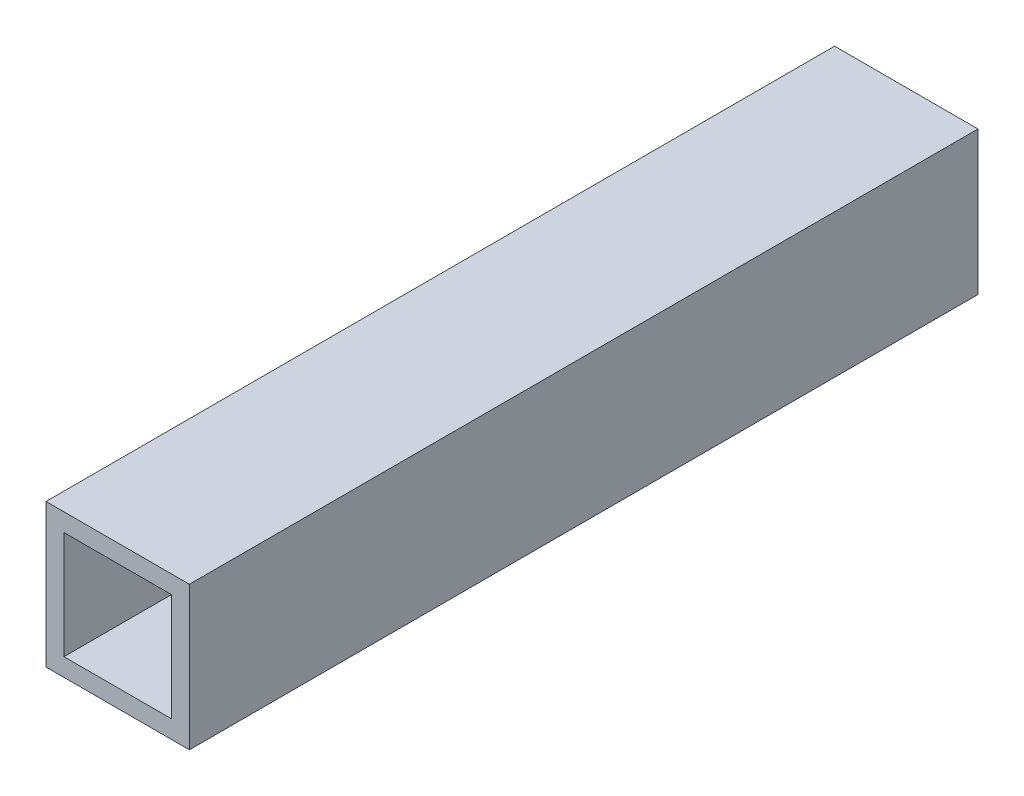
ISO-10303-21;
HEADER;
FILE_DESCRIPTION(('STEP AP214'),'2;1');
FILE_NAME('part.step','',(''),(''),'','','');
FILE_SCHEMA(('AUTOMOTIVE_DESIGN { 1 0 10303 214 1 1 1 1 }'));
ENDSEC;
DATA;
#1=APPLICATION_CONTEXT('core data for automotive mechanical design processes');
#2=APPLICATION_PROTOCOL_DEFINITION('international standard','automotive_design',2000,#1);
#3=PRODUCT_CONTEXT('',#1,'mechanical');
#4=PRODUCT('Part','Part','',(#3));
#5=PRODUCT_RELATED_PRODUCT_CATEGORY('part','',(#4));
#6=PRODUCT_DEFINITION_FORMATION('','',#4);
#7=PRODUCT_DEFINITION_CONTEXT('part definition',#1,'design');
#8=PRODUCT_DEFINITION('design','',#6,#7);
#9=PRODUCT_DEFINITION_SHAPE('','',#8);
#10=(LENGTH_UNIT() NAMED_UNIT(*) SI_UNIT(.MILLI.,.METRE.));
#11=(NAMED_UNIT(*) PLANE_ANGLE_UNIT() SI_UNIT($,.RADIAN.));
#12=(NAMED_UNIT(*) SI_UNIT($,.STERADIAN.) SOLID_ANGLE_UNIT());
#13=UNCERTAINTY_MEASURE_WITH_UNIT(LENGTH_MEASURE(1.E-05),#10,'distance_accuracy_value','');
#14=(GEOMETRIC_REPRESENTATION_CONTEXT(3) GLOBAL_UNCERTAINTY_ASSIGNED_CONTEXT((#13)) GLOBAL_UNIT_ASSIGNED_CONTEXT((#10,
#11,#12)) REPRESENTATION_CONTEXT('',''));
#15=CARTESIAN_POINT('',(0.,0.,0.));
#16=DIRECTION('',(0.,0.,1.));
#17=DIRECTION('',(1.,0.,0.));
#18=AXIS2_PLACEMENT_3D('',#15,#16,#17);
#19=CARTESIAN_POINT('',(0.,0.,139.7));
#20=DIRECTION('',(0.,0.,1.));
#21=DIRECTION('',(1.,0.,0.));
#22=AXIS2_PLACEMENT_3D('',#19,#20,#21);
#23=PLANE('',#22);
#24=DIRECTION('',(0.,1.,0.));
#25=VECTOR('',#24,1.);
#26=CARTESIAN_POINT('',(0.,0.,139.7));
#27=LINE('',#26,#25);
#28=CARTESIAN_POINT('',(0.,0.,139.7));
#29=VERTEX_POINT('',#28);
#30=CARTESIAN_POINT('',(0.,25.4,139.7));
#31=VERTEX_POINT('',#30);
#32=EDGE_CURVE('E153',#29,#31,#27,.T.);
#33=ORIENTED_EDGE('',*,*,#32,.T.);
#34=DIRECTION('',(-1.,0.,0.));
#35=VECTOR('',#34,1.);
#36=CARTESIAN_POINT('',(0.,25.4,139.7));
#37=LINE('',#36,#35);
#38=CARTESIAN_POINT('',(-25.4,25.4,139.7));
#39=VERTEX_POINT('',#38);
#40=EDGE_CURVE('E157',#31,#39,#37,.T.);
#41=ORIENTED_EDGE('',*,*,#40,.T.);
#42=DIRECTION('',(0.,-1.,0.));
#43=VECTOR('',#42,1.);
#44=CARTESIAN_POINT('',(-25.4,0.,139.7));
#45=LINE('',#44,#43);
#46=CARTESIAN_POINT('',(-25.4,0.,139.7));
#47=VERTEX_POINT('',#46);
#48=EDGE_CURVE('E161',#39,#47,#45,.T.);
#49=ORIENTED_EDGE('',*,*,#48,.T.);
#50=DIRECTION('',(1.,0.,0.));
#51=VECTOR('',#50,1.);
#52=CARTESIAN_POINT('',(0.,0.,139.7));
#53=LINE('',#52,#51);
#54=EDGE_CURVE('E164',#47,#29,#53,.T.);
#55=ORIENTED_EDGE('',*,*,#54,.T.);
#56=EDGE_LOOP('',(#33,#41,#49,#55));
#57=FACE_BOUND('',#56,.T.);
#58=DIRECTION('',(-1.,0.,0.));
#59=VECTOR('',#58,1.);
#60=CARTESIAN_POINT('',(-3.175,22.225,139.7));
#61=LINE('',#60,#59);
#62=CARTESIAN_POINT('',(-3.175,22.225,139.7));
#63=VERTEX_POINT('',#62);
#64=CARTESIAN_POINT('',(-22.225,22.225,139.7));
#65=VERTEX_POINT('',#64);
#66=EDGE_CURVE('E114',#63,#65,#61,.T.);
#67=ORIENTED_EDGE('',*,*,#66,.F.);
#68=DIRECTION('',(0.,1.,0.));
#69=VECTOR('',#68,1.);
#70=CARTESIAN_POINT('',(-3.175,3.175,139.7));
#71=LINE('',#70,#69);
#72=CARTESIAN_POINT('',(-3.175,3.175,139.7));
#73=VERTEX_POINT('',#72);
#74=EDGE_CURVE('E105',#73,#63,#71,.T.);
#75=ORIENTED_EDGE('',*,*,#74,.F.);
#76=DIRECTION('',(1.,0.,0.));
#77=VECTOR('',#76,1.);
#78=CARTESIAN_POINT('',(-3.175,3.175,139.7));
#79=LINE('',#78,#77);
#80=CARTESIAN_POINT('',(-22.225,3.175,139.7));
#81=VERTEX_POINT('',#80);
#82=EDGE_CURVE('E131',#81,#73,#79,.T.);
#83=ORIENTED_EDGE('',*,*,#82,.F.);
#84=DIRECTION('',(0.,-1.,0.));
#85=VECTOR('',#84,1.);
#86=CARTESIAN_POINT('',(-22.225,3.175,139.7));
#87=LINE('',#86,#85);
#88=EDGE_CURVE('E127',#65,#81,#87,.T.);
#89=ORIENTED_EDGE('',*,*,#88,.F.);
#90=EDGE_LOOP('',(#67,#75,#83,#89));
#91=FACE_BOUND('',#90,.T.);
#92=ADVANCED_FACE('F39',(#57,#91),#23,.T.);
#93=CARTESIAN_POINT('',(0.,0.,0.));
#94=DIRECTION('',(0.,0.,1.));
#95=DIRECTION('',(1.,0.,0.));
#96=AXIS2_PLACEMENT_3D('',#93,#94,#95);
#97=PLANE('',#96);
#98=DIRECTION('',(0.,1.,0.));
#99=VECTOR('',#98,1.);
#100=CARTESIAN_POINT('',(0.,0.,0.));
#101=LINE('',#100,#99);
#102=CARTESIAN_POINT('',(0.,0.,0.));
#103=VERTEX_POINT('',#102);
#104=CARTESIAN_POINT('',(0.,25.4,0.));
#105=VERTEX_POINT('',#104);
#106=EDGE_CURVE('E123',#103,#105,#101,.T.);
#107=ORIENTED_EDGE('',*,*,#106,.F.);
#108=DIRECTION('',(1.,0.,0.));
#109=VECTOR('',#108,1.);
#110=CARTESIAN_POINT('',(0.,0.,0.));
#111=LINE('',#110,#109);
#112=CARTESIAN_POINT('',(-25.4,0.,0.));
#113=VERTEX_POINT('',#112);
#114=EDGE_CURVE('E158',#113,#103,#111,.T.);
#115=ORIENTED_EDGE('',*,*,#114,.F.);
#116=DIRECTION('',(0.,-1.,0.));
#117=VECTOR('',#116,1.);
#118=CARTESIAN_POINT('',(-25.4,0.,0.));
#119=LINE('',#118,#117);
#120=CARTESIAN_POINT('',(-25.4,25.4,0.));
#121=VERTEX_POINT('',#120);
#122=EDGE_CURVE('E174',#121,#113,#119,.T.);
#123=ORIENTED_EDGE('',*,*,#122,.F.);
#124=DIRECTION('',(-1.,0.,0.));
#125=VECTOR('',#124,1.);
#126=CARTESIAN_POINT('',(0.,25.4,0.));
#127=LINE('',#126,#125);
#128=EDGE_CURVE('E171',#105,#121,#127,.T.);
#129=ORIENTED_EDGE('',*,*,#128,.F.);
#130=EDGE_LOOP('',(#107,#115,#123,#129));
#131=FACE_BOUND('',#130,.T.);
#132=DIRECTION('',(0.,1.,0.));
#133=VECTOR('',#132,1.);
#134=CARTESIAN_POINT('',(-3.175,3.175,0.));
#135=LINE('',#134,#133);
#136=CARTESIAN_POINT('',(-3.175,3.175,0.));
#137=VERTEX_POINT('',#136);
#138=CARTESIAN_POINT('',(-3.175,22.225,0.));
#139=VERTEX_POINT('',#138);
#140=EDGE_CURVE('E63',#137,#139,#135,.T.);
#141=ORIENTED_EDGE('',*,*,#140,.T.);
#142=DIRECTION('',(-1.,0.,0.));
#143=VECTOR('',#142,1.);
#144=CARTESIAN_POINT('',(-3.175,22.225,0.));
#145=LINE('',#144,#143);
#146=CARTESIAN_POINT('',(-22.225,22.225,0.));
#147=VERTEX_POINT('',#146);
#148=EDGE_CURVE('E121',#139,#147,#145,.T.);
#149=ORIENTED_EDGE('',*,*,#148,.T.);
#150=DIRECTION('',(0.,-1.,0.));
#151=VECTOR('',#150,1.);
#152=CARTESIAN_POINT('',(-22.225,3.175,0.));
#153=LINE('',#152,#151);
#154=CARTESIAN_POINT('',(-22.225,3.175,0.));
#155=VERTEX_POINT('',#154);
#156=EDGE_CURVE('E140',#147,#155,#153,.T.);
#157=ORIENTED_EDGE('',*,*,#156,.T.);
#158=DIRECTION('',(1.,0.,0.));
#159=VECTOR('',#158,1.);
#160=CARTESIAN_POINT('',(-3.175,3.175,0.));
#161=LINE('',#160,#159);
#162=EDGE_CURVE('E115',#155,#137,#161,.T.);
#163=ORIENTED_EDGE('',*,*,#162,.T.);
#164=EDGE_LOOP('',(#141,#149,#157,#163));
#165=FACE_BOUND('',#164,.T.);
#166=ADVANCED_FACE('F197',(#131,#165),#97,.F.);
#167=CARTESIAN_POINT('',(0.,0.,139.7));
#168=DIRECTION('',(-1.,0.,0.));
#169=DIRECTION('',(0.,-1.,0.));
#170=AXIS2_PLACEMENT_3D('',#167,#168,#169);
#171=PLANE('',#170);
#172=ORIENTED_EDGE('',*,*,#106,.T.);
#173=DIRECTION('',(0.,0.,-1.));
#174=VECTOR('',#173,1.);
#175=CARTESIAN_POINT('',(0.,25.4,139.7));
#176=LINE('',#175,#174);
#177=EDGE_CURVE('E11',#31,#105,#176,.T.);
#178=ORIENTED_EDGE('',*,*,#177,.F.);
#179=ORIENTED_EDGE('',*,*,#32,.F.);
#180=DIRECTION('',(0.,0.,-1.));
#181=VECTOR('',#180,1.);
#182=CARTESIAN_POINT('',(0.,0.,139.7));
#183=LINE('',#182,#181);
#184=EDGE_CURVE('E167',#29,#103,#183,.T.);
#185=ORIENTED_EDGE('',*,*,#184,.T.);
#186=EDGE_LOOP('',(#172,#178,#179,#185));
#187=FACE_BOUND('',#186,.T.);
#188=ADVANCED_FACE('F41',(#187),#171,.F.);
#189=CARTESIAN_POINT('',(0.,25.4,139.7));
#190=DIRECTION('',(0.,-1.,0.));
#191=DIRECTION('',(1.,0.,0.));
#192=AXIS2_PLACEMENT_3D('',#189,#190,#191);
#193=PLANE('',#192);
#194=ORIENTED_EDGE('',*,*,#128,.T.);
#195=DIRECTION('',(0.,0.,-1.));
#196=VECTOR('',#195,1.);
#197=CARTESIAN_POINT('',(-25.4,25.4,139.7));
#198=LINE('',#197,#196);
#199=EDGE_CURVE('E48',#39,#121,#198,.T.);
#200=ORIENTED_EDGE('',*,*,#199,.F.);
#201=ORIENTED_EDGE('',*,*,#40,.F.);
#202=ORIENTED_EDGE('',*,*,#177,.T.);
#203=EDGE_LOOP('',(#194,#200,#201,#202));
#204=FACE_BOUND('',#203,.T.);
#205=ADVANCED_FACE('F207',(#204),#193,.F.);
#206=CARTESIAN_POINT('',(-25.4,0.,139.7));
#207=DIRECTION('',(1.,0.,0.));
#208=DIRECTION('',(0.,0.,-1.));
#209=AXIS2_PLACEMENT_3D('',#206,#207,#208);
#210=PLANE('',#209);
#211=ORIENTED_EDGE('',*,*,#122,.T.);
#212=DIRECTION('',(0.,0.,-1.));
#213=VECTOR('',#212,1.);
#214=CARTESIAN_POINT('',(-25.4,0.,139.7));
#215=LINE('',#214,#213);
#216=EDGE_CURVE('E182',#47,#113,#215,.T.);
#217=ORIENTED_EDGE('',*,*,#216,.F.);
#218=ORIENTED_EDGE('',*,*,#48,.F.);
#219=ORIENTED_EDGE('',*,*,#199,.T.);
#220=EDGE_LOOP('',(#211,#217,#218,#219));
#221=FACE_BOUND('',#220,.T.);
#222=ADVANCED_FACE('F191',(#221),#210,.F.);
#223=CARTESIAN_POINT('',(0.,0.,139.7));
#224=DIRECTION('',(0.,1.,0.));
#225=DIRECTION('',(0.,0.,1.));
#226=AXIS2_PLACEMENT_3D('',#223,#224,#225);
#227=PLANE('',#226);
#228=ORIENTED_EDGE('',*,*,#114,.T.);
#229=ORIENTED_EDGE('',*,*,#184,.F.);
#230=ORIENTED_EDGE('',*,*,#54,.F.);
#231=ORIENTED_EDGE('',*,*,#216,.T.);
#232=EDGE_LOOP('',(#228,#229,#230,#231));
#233=FACE_BOUND('',#232,.T.);
#234=ADVANCED_FACE('F201',(#233),#227,.F.);
#235=CARTESIAN_POINT('',(-3.175,3.175,139.7));
#236=DIRECTION('',(-1.,0.,0.));
#237=DIRECTION('',(0.,0.,1.));
#238=AXIS2_PLACEMENT_3D('',#235,#236,#237);
#239=PLANE('',#238);
#240=ORIENTED_EDGE('',*,*,#140,.F.);
#241=DIRECTION('',(0.,0.,-1.));
#242=VECTOR('',#241,1.);
#243=CARTESIAN_POINT('',(-3.175,3.175,139.7));
#244=LINE('',#243,#242);
#245=EDGE_CURVE('E109',#73,#137,#244,.T.);
#246=ORIENTED_EDGE('',*,*,#245,.F.);
#247=ORIENTED_EDGE('',*,*,#74,.T.);
#248=DIRECTION('',(0.,0.,-1.));
#249=VECTOR('',#248,1.);
#250=CARTESIAN_POINT('',(-3.175,22.225,139.7));
#251=LINE('',#250,#249);
#252=EDGE_CURVE('E108',#63,#139,#251,.T.);
#253=ORIENTED_EDGE('',*,*,#252,.T.);
#254=EDGE_LOOP('',(#240,#246,#247,#253));
#255=FACE_BOUND('',#254,.T.);
#256=ADVANCED_FACE('F107',(#255),#239,.T.);
#257=CARTESIAN_POINT('',(-3.175,22.225,139.7));
#258=DIRECTION('',(0.,-1.,0.));
#259=DIRECTION('',(1.,0.,0.));
#260=AXIS2_PLACEMENT_3D('',#257,#258,#259);
#261=PLANE('',#260);
#262=ORIENTED_EDGE('',*,*,#148,.F.);
#263=ORIENTED_EDGE('',*,*,#252,.F.);
#264=ORIENTED_EDGE('',*,*,#66,.T.);
#265=DIRECTION('',(0.,0.,-1.));
#266=VECTOR('',#265,1.);
#267=CARTESIAN_POINT('',(-22.225,22.225,139.7));
#268=LINE('',#267,#266);
#269=EDGE_CURVE('E124',#65,#147,#268,.T.);
#270=ORIENTED_EDGE('',*,*,#269,.T.);
#271=EDGE_LOOP('',(#262,#263,#264,#270));
#272=FACE_BOUND('',#271,.T.);
#273=ADVANCED_FACE('F118',(#272),#261,.T.);
#274=CARTESIAN_POINT('',(-22.225,3.175,139.7));
#275=DIRECTION('',(1.,0.,0.));
#276=DIRECTION('',(0.,0.,-1.));
#277=AXIS2_PLACEMENT_3D('',#274,#275,#276);
#278=PLANE('',#277);
#279=ORIENTED_EDGE('',*,*,#156,.F.);
#280=ORIENTED_EDGE('',*,*,#269,.F.);
#281=ORIENTED_EDGE('',*,*,#88,.T.);
#282=DIRECTION('',(0.,0.,-1.));
#283=VECTOR('',#282,1.);
#284=CARTESIAN_POINT('',(-22.225,3.175,139.7));
#285=LINE('',#284,#283);
#286=EDGE_CURVE('E55',#81,#155,#285,.T.);
#287=ORIENTED_EDGE('',*,*,#286,.T.);
#288=EDGE_LOOP('',(#279,#280,#281,#287));
#289=FACE_BOUND('',#288,.T.);
#290=ADVANCED_FACE('F230',(#289),#278,.T.);
#291=CARTESIAN_POINT('',(-3.175,3.175,139.7));
#292=DIRECTION('',(0.,1.,0.));
#293=DIRECTION('',(-1.,0.,0.));
#294=AXIS2_PLACEMENT_3D('',#291,#292,#293);
#295=PLANE('',#294);
#296=ORIENTED_EDGE('',*,*,#162,.F.);
#297=ORIENTED_EDGE('',*,*,#286,.F.);
#298=ORIENTED_EDGE('',*,*,#82,.T.);
#299=ORIENTED_EDGE('',*,*,#245,.T.);
#300=EDGE_LOOP('',(#296,#297,#298,#299));
#301=FACE_BOUND('',#300,.T.);
#302=ADVANCED_FACE('F234',(#301),#295,.T.);
#303=CLOSED_SHELL('',(#92,#166,#188,#205,#222,#234,#256,#273,#290,#302));
#304=MANIFOLD_SOLID_BREP('B2',#303);
#305=ADVANCED_BREP_SHAPE_REPRESENTATION('',(#18,#304),#14);
#306=SHAPE_DEFINITION_REPRESENTATION(#9,#305);
ENDSEC;
END-ISO-10303-21;
